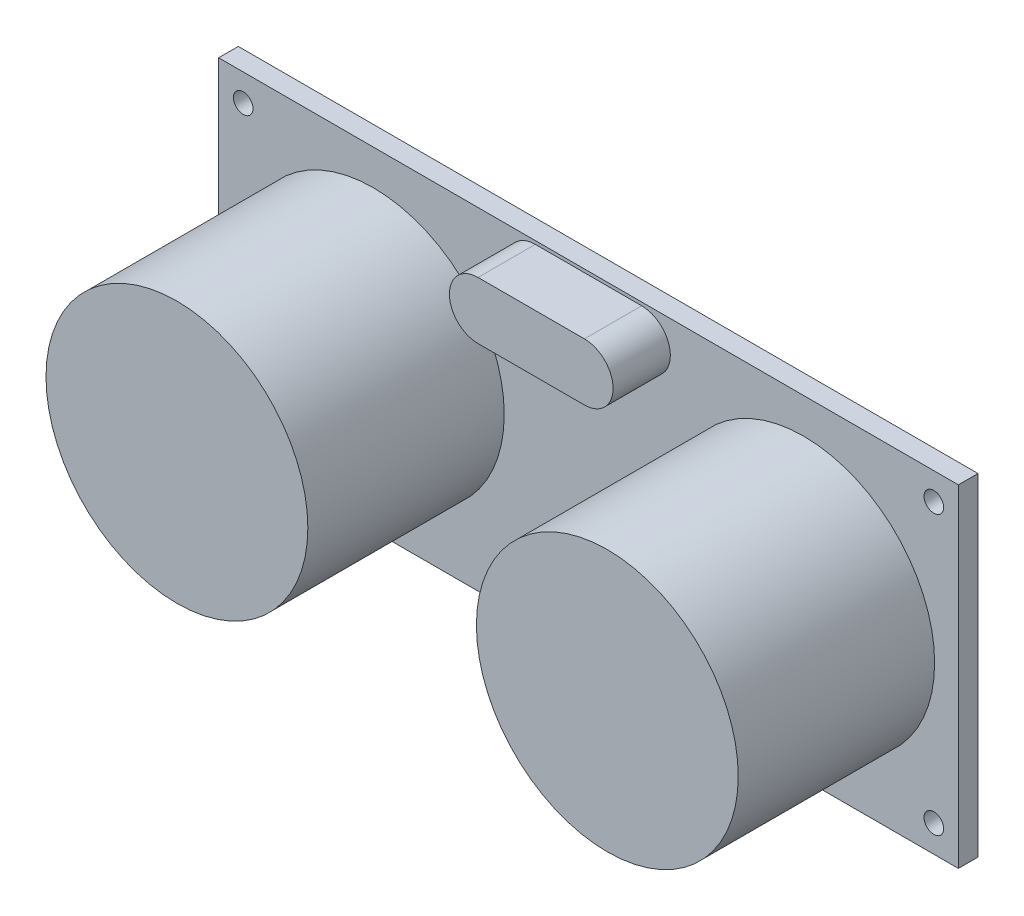
ISO-10303-21;
HEADER;
FILE_DESCRIPTION(('STEP AP214'),'2;1');
FILE_NAME('part.step','',(''),(''),'','','');
FILE_SCHEMA(('AUTOMOTIVE_DESIGN { 1 0 10303 214 1 1 1 1 }'));
ENDSEC;
DATA;
#1=APPLICATION_CONTEXT('core data for automotive mechanical design processes');
#2=APPLICATION_PROTOCOL_DEFINITION('international standard','automotive_design',2000,#1);
#3=PRODUCT_CONTEXT('',#1,'mechanical');
#4=PRODUCT('Part','Part','',(#3));
#5=PRODUCT_RELATED_PRODUCT_CATEGORY('part','',(#4));
#6=PRODUCT_DEFINITION_FORMATION('','',#4);
#7=PRODUCT_DEFINITION_CONTEXT('part definition',#1,'design');
#8=PRODUCT_DEFINITION('design','',#6,#7);
#9=PRODUCT_DEFINITION_SHAPE('','',#8);
#10=(LENGTH_UNIT() NAMED_UNIT(*) SI_UNIT(.MILLI.,.METRE.));
#11=(NAMED_UNIT(*) PLANE_ANGLE_UNIT() SI_UNIT($,.RADIAN.));
#12=(NAMED_UNIT(*) SI_UNIT($,.STERADIAN.) SOLID_ANGLE_UNIT());
#13=UNCERTAINTY_MEASURE_WITH_UNIT(LENGTH_MEASURE(1.E-05),#10,'distance_accuracy_value','');
#14=(GEOMETRIC_REPRESENTATION_CONTEXT(3) GLOBAL_UNCERTAINTY_ASSIGNED_CONTEXT((#13)) GLOBAL_UNIT_ASSIGNED_CONTEXT((#10,
#11,#12)) REPRESENTATION_CONTEXT('',''));
#15=CARTESIAN_POINT('',(0.,0.,0.));
#16=DIRECTION('',(0.,0.,1.));
#17=DIRECTION('',(1.,0.,0.));
#18=AXIS2_PLACEMENT_3D('',#15,#16,#17);
#19=CARTESIAN_POINT('',(0.,-15.9,-6.7));
#20=DIRECTION('',(0.,-1.,0.));
#21=DIRECTION('',(0.,0.,-1.));
#22=AXIS2_PLACEMENT_3D('',#19,#20,#21);
#23=PLANE('',#22);
#24=DIRECTION('',(0.,0.,1.));
#25=VECTOR('',#24,1.);
#26=CARTESIAN_POINT('',(5.,-15.9,-4.1));
#27=LINE('',#26,#25);
#28=CARTESIAN_POINT('',(5.,-15.9,-4.1));
#29=VERTEX_POINT('',#28);
#30=CARTESIAN_POINT('',(5.,-15.9,-1.7));
#31=VERTEX_POINT('',#30);
#32=EDGE_CURVE('P0_E142',#29,#31,#27,.T.);
#33=ORIENTED_EDGE('',*,*,#32,.T.);
#34=DIRECTION('',(-1.,0.,0.));
#35=VECTOR('',#34,1.);
#36=CARTESIAN_POINT('',(5.,-15.9,-1.7));
#37=LINE('',#36,#35);
#38=CARTESIAN_POINT('',(-5.,-15.9,-1.7));
#39=VERTEX_POINT('',#38);
#40=EDGE_CURVE('P0_E11',#31,#39,#37,.T.);
#41=ORIENTED_EDGE('',*,*,#40,.T.);
#42=DIRECTION('',(0.,0.,-1.));
#43=VECTOR('',#42,1.);
#44=CARTESIAN_POINT('',(-5.,-15.9,-1.7));
#45=LINE('',#44,#43);
#46=CARTESIAN_POINT('',(-5.,-15.9,-4.1));
#47=VERTEX_POINT('',#46);
#48=EDGE_CURVE('P0_E94',#39,#47,#45,.T.);
#49=ORIENTED_EDGE('',*,*,#48,.T.);
#50=DIRECTION('',(1.,0.,0.));
#51=VECTOR('',#50,1.);
#52=CARTESIAN_POINT('',(-5.,-15.9,-4.1));
#53=LINE('',#52,#51);
#54=EDGE_CURVE('P0_E126',#47,#29,#53,.T.);
#55=ORIENTED_EDGE('',*,*,#54,.T.);
#56=EDGE_LOOP('',(#33,#41,#49,#55));
#57=FACE_BOUND('',#56,.T.);
#58=ADVANCED_FACE('P0_F16',(#57),#23,.T.);
#59=CARTESIAN_POINT('',(0.,-13.025,-1.7));
#60=DIRECTION('',(0.,0.,1.));
#61=DIRECTION('',(1.,0.,0.));
#62=AXIS2_PLACEMENT_3D('',#59,#60,#61);
#63=PLANE('',#62);
#64=DIRECTION('',(-1.,0.,0.));
#65=VECTOR('',#64,1.);
#66=CARTESIAN_POINT('',(5.,-10.15,-1.7));
#67=LINE('',#66,#65);
#68=CARTESIAN_POINT('',(5.,-10.15,-1.7));
#69=VERTEX_POINT('',#68);
#70=CARTESIAN_POINT('',(-5.,-10.15,-1.7));
#71=VERTEX_POINT('',#70);
#72=EDGE_CURVE('P0_E92',#69,#71,#67,.T.);
#73=ORIENTED_EDGE('',*,*,#72,.T.);
#74=DIRECTION('',(0.,-1.,0.));
#75=VECTOR('',#74,1.);
#76=CARTESIAN_POINT('',(-5.,-10.15,-1.7));
#77=LINE('',#76,#75);
#78=EDGE_CURVE('P0_E24',#71,#39,#77,.T.);
#79=ORIENTED_EDGE('',*,*,#78,.T.);
#80=ORIENTED_EDGE('',*,*,#40,.F.);
#81=DIRECTION('',(0.,-1.,0.));
#82=VECTOR('',#81,1.);
#83=CARTESIAN_POINT('',(5.,-10.15,-1.7));
#84=LINE('',#83,#82);
#85=EDGE_CURVE('P0_E138',#69,#31,#84,.T.);
#86=ORIENTED_EDGE('',*,*,#85,.F.);
#87=EDGE_LOOP('',(#73,#79,#80,#86));
#88=FACE_BOUND('',#87,.T.);
#89=ADVANCED_FACE('P0_F152',(#88),#63,.T.);
#90=CARTESIAN_POINT('',(0.,-7.65,-2.05));
#91=DIRECTION('',(0.,1.,0.));
#92=DIRECTION('',(1.,0.,0.));
#93=AXIS2_PLACEMENT_3D('',#90,#91,#92);
#94=PLANE('',#93);
#95=DIRECTION('',(1.,0.,0.));
#96=VECTOR('',#95,1.);
#97=CARTESIAN_POINT('',(-5.,-7.65,0.));
#98=LINE('',#97,#96);
#99=CARTESIAN_POINT('',(-5.,-7.65,0.));
#100=VERTEX_POINT('',#99);
#101=CARTESIAN_POINT('',(5.,-7.65,0.));
#102=VERTEX_POINT('',#101);
#103=EDGE_CURVE('P0_E86',#100,#102,#98,.T.);
#104=ORIENTED_EDGE('',*,*,#103,.T.);
#105=DIRECTION('',(0.,0.,-1.));
#106=VECTOR('',#105,1.);
#107=CARTESIAN_POINT('',(5.,-7.65,0.));
#108=LINE('',#107,#106);
#109=CARTESIAN_POINT('',(5.,-7.65,-4.1));
#110=VERTEX_POINT('',#109);
#111=EDGE_CURVE('P0_E144',#102,#110,#108,.T.);
#112=ORIENTED_EDGE('',*,*,#111,.T.);
#113=DIRECTION('',(1.,0.,0.));
#114=VECTOR('',#113,1.);
#115=CARTESIAN_POINT('',(-5.,-7.65,-4.1));
#116=LINE('',#115,#114);
#117=CARTESIAN_POINT('',(-5.,-7.65,-4.1));
#118=VERTEX_POINT('',#117);
#119=EDGE_CURVE('P0_E89',#118,#110,#116,.T.);
#120=ORIENTED_EDGE('',*,*,#119,.F.);
#121=DIRECTION('',(0.,0.,-1.));
#122=VECTOR('',#121,1.);
#123=CARTESIAN_POINT('',(-5.,-7.65,0.));
#124=LINE('',#123,#122);
#125=EDGE_CURVE('P0_E82',#100,#118,#124,.T.);
#126=ORIENTED_EDGE('',*,*,#125,.F.);
#127=EDGE_LOOP('',(#104,#112,#120,#126));
#128=FACE_BOUND('',#127,.T.);
#129=ADVANCED_FACE('P0_F88',(#128),#94,.T.);
#130=CARTESIAN_POINT('',(-5.,-11.775,-2.05));
#131=DIRECTION('',(-1.,0.,0.));
#132=DIRECTION('',(0.,0.,1.));
#133=AXIS2_PLACEMENT_3D('',#130,#131,#132);
#134=PLANE('',#133);
#135=DIRECTION('',(0.,1.,0.));
#136=VECTOR('',#135,1.);
#137=CARTESIAN_POINT('',(-5.,-10.15,0.));
#138=LINE('',#137,#136);
#139=CARTESIAN_POINT('',(-5.,-10.15,0.));
#140=VERTEX_POINT('',#139);
#141=EDGE_CURVE('P0_E98',#140,#100,#138,.T.);
#142=ORIENTED_EDGE('',*,*,#141,.T.);
#143=ORIENTED_EDGE('',*,*,#125,.T.);
#144=DIRECTION('',(0.,1.,0.));
#145=VECTOR('',#144,1.);
#146=CARTESIAN_POINT('',(-5.,-15.9,-4.1));
#147=LINE('',#146,#145);
#148=EDGE_CURVE('P0_E131',#47,#118,#147,.T.);
#149=ORIENTED_EDGE('',*,*,#148,.F.);
#150=ORIENTED_EDGE('',*,*,#48,.F.);
#151=ORIENTED_EDGE('',*,*,#78,.F.);
#152=DIRECTION('',(0.,0.,-1.));
#153=VECTOR('',#152,1.);
#154=CARTESIAN_POINT('',(-5.,-10.15,0.));
#155=LINE('',#154,#153);
#156=EDGE_CURVE('P0_E101',#140,#71,#155,.T.);
#157=ORIENTED_EDGE('',*,*,#156,.F.);
#158=EDGE_LOOP('',(#142,#143,#149,#150,#151,#157));
#159=FACE_BOUND('',#158,.T.);
#160=ADVANCED_FACE('P0_F97',(#159),#134,.T.);
#161=CARTESIAN_POINT('',(0.,-10.15,-2.05));
#162=DIRECTION('',(0.,-1.,0.));
#163=DIRECTION('',(0.,0.,-1.));
#164=AXIS2_PLACEMENT_3D('',#161,#162,#163);
#165=PLANE('',#164);
#166=DIRECTION('',(-1.,0.,0.));
#167=VECTOR('',#166,1.);
#168=CARTESIAN_POINT('',(5.,-10.15,0.));
#169=LINE('',#168,#167);
#170=CARTESIAN_POINT('',(5.,-10.15,0.));
#171=VERTEX_POINT('',#170);
#172=EDGE_CURVE('P0_E106',#171,#140,#169,.T.);
#173=ORIENTED_EDGE('',*,*,#172,.T.);
#174=ORIENTED_EDGE('',*,*,#156,.T.);
#175=ORIENTED_EDGE('',*,*,#72,.F.);
#176=DIRECTION('',(0.,0.,-1.));
#177=VECTOR('',#176,1.);
#178=CARTESIAN_POINT('',(5.,-10.15,0.));
#179=LINE('',#178,#177);
#180=EDGE_CURVE('P0_E129',#171,#69,#179,.T.);
#181=ORIENTED_EDGE('',*,*,#180,.F.);
#182=EDGE_LOOP('',(#173,#174,#175,#181));
#183=FACE_BOUND('',#182,.T.);
#184=ADVANCED_FACE('P0_F162',(#183),#165,.T.);
#185=CARTESIAN_POINT('',(5.,-11.775,-2.05));
#186=DIRECTION('',(1.,0.,0.));
#187=DIRECTION('',(0.,1.,0.));
#188=AXIS2_PLACEMENT_3D('',#185,#186,#187);
#189=PLANE('',#188);
#190=DIRECTION('',(0.,-1.,0.));
#191=VECTOR('',#190,1.);
#192=CARTESIAN_POINT('',(5.,-7.65,0.));
#193=LINE('',#192,#191);
#194=EDGE_CURVE('P0_E112',#102,#171,#193,.T.);
#195=ORIENTED_EDGE('',*,*,#194,.T.);
#196=ORIENTED_EDGE('',*,*,#180,.T.);
#197=ORIENTED_EDGE('',*,*,#85,.T.);
#198=ORIENTED_EDGE('',*,*,#32,.F.);
#199=DIRECTION('',(0.,-1.,0.));
#200=VECTOR('',#199,1.);
#201=CARTESIAN_POINT('',(5.,-7.65,-4.1));
#202=LINE('',#201,#200);
#203=EDGE_CURVE('P0_E121',#110,#29,#202,.T.);
#204=ORIENTED_EDGE('',*,*,#203,.F.);
#205=ORIENTED_EDGE('',*,*,#111,.F.);
#206=EDGE_LOOP('',(#195,#196,#197,#198,#204,#205));
#207=FACE_BOUND('',#206,.T.);
#208=ADVANCED_FACE('P0_F161',(#207),#189,.T.);
#209=CARTESIAN_POINT('',(0.,-7.775,-4.1));
#210=DIRECTION('',(0.,0.,-1.));
#211=DIRECTION('',(0.,-1.,0.));
#212=AXIS2_PLACEMENT_3D('',#209,#210,#211);
#213=PLANE('',#212);
#214=ORIENTED_EDGE('',*,*,#203,.T.);
#215=ORIENTED_EDGE('',*,*,#54,.F.);
#216=ORIENTED_EDGE('',*,*,#148,.T.);
#217=ORIENTED_EDGE('',*,*,#119,.T.);
#218=EDGE_LOOP('',(#214,#215,#216,#217));
#219=FACE_BOUND('',#218,.T.);
#220=ADVANCED_FACE('P0_F157',(#219),#213,.T.);
#221=CARTESIAN_POINT('',(0.,-5.15,0.));
#222=DIRECTION('',(0.,0.,-1.));
#223=DIRECTION('',(0.,-1.,0.));
#224=AXIS2_PLACEMENT_3D('',#221,#222,#223);
#225=PLANE('',#224);
#226=ORIENTED_EDGE('',*,*,#103,.F.);
#227=ORIENTED_EDGE('',*,*,#141,.F.);
#228=ORIENTED_EDGE('',*,*,#172,.F.);
#229=ORIENTED_EDGE('',*,*,#194,.F.);
#230=EDGE_LOOP('',(#226,#227,#228,#229));
#231=FACE_BOUND('',#230,.T.);
#232=ADVANCED_FACE('P0_F108',(#231),#225,.F.);
#233=CLOSED_SHELL('',(#58,#89,#129,#160,#184,#208,#220,#232));
#234=MANIFOLD_SOLID_BREP('P0_B1',#233);
#235=CARTESIAN_POINT('',(0.,9.95,2.95));
#236=DIRECTION('',(0.,1.,0.));
#237=DIRECTION('',(1.,0.,0.));
#238=AXIS2_PLACEMENT_3D('',#235,#236,#237);
#239=PLANE('',#238);
#240=DIRECTION('',(-1.,0.,0.));
#241=VECTOR('',#240,1.);
#242=CARTESIAN_POINT('',(3.25,9.95,1.2));
#243=LINE('',#242,#241);
#244=CARTESIAN_POINT('',(3.25,9.95,1.2));
#245=VERTEX_POINT('',#244);
#246=CARTESIAN_POINT('',(-3.25,9.95,1.2));
#247=VERTEX_POINT('',#246);
#248=EDGE_CURVE('P1_E68',#245,#247,#243,.T.);
#249=ORIENTED_EDGE('',*,*,#248,.T.);
#250=DIRECTION('',(0.,0.,1.));
#251=VECTOR('',#250,1.);
#252=CARTESIAN_POINT('',(-3.25,9.95,1.2));
#253=LINE('',#252,#251);
#254=CARTESIAN_POINT('',(-3.25,9.95,4.7));
#255=VERTEX_POINT('',#254);
#256=EDGE_CURVE('P1_E64',#247,#255,#253,.T.);
#257=ORIENTED_EDGE('',*,*,#256,.T.);
#258=DIRECTION('',(-1.,0.,0.));
#259=VECTOR('',#258,1.);
#260=CARTESIAN_POINT('',(3.25,9.95,4.7));
#261=LINE('',#260,#259);
#262=CARTESIAN_POINT('',(3.25,9.95,4.7));
#263=VERTEX_POINT('',#262);
#264=EDGE_CURVE('P1_E65',#263,#255,#261,.T.);
#265=ORIENTED_EDGE('',*,*,#264,.F.);
#266=DIRECTION('',(0.,0.,1.));
#267=VECTOR('',#266,1.);
#268=CARTESIAN_POINT('',(3.25,9.95,1.2));
#269=LINE('',#268,#267);
#270=EDGE_CURVE('P1_E11',#245,#263,#269,.T.);
#271=ORIENTED_EDGE('',*,*,#270,.F.);
#272=EDGE_LOOP('',(#249,#257,#265,#271));
#273=FACE_BOUND('',#272,.T.);
#274=ADVANCED_FACE('P1_F16',(#273),#239,.T.);
#275=CARTESIAN_POINT('',(3.25,8.2,1.2));
#276=DIRECTION('',(0.,0.,1.));
#277=DIRECTION('',(0.,-1.,0.));
#278=AXIS2_PLACEMENT_3D('',#275,#276,#277);
#279=CYLINDRICAL_SURFACE('',#278,1.75);
#280=CARTESIAN_POINT('',(3.25,8.2,1.2));
#281=DIRECTION('',(0.,0.,1.));
#282=DIRECTION('',(0.,-1.,0.));
#283=AXIS2_PLACEMENT_3D('',#280,#281,#282);
#284=CIRCLE('',#283,1.75);
#285=CARTESIAN_POINT('',(3.25,6.45,1.2));
#286=VERTEX_POINT('',#285);
#287=EDGE_CURVE('P1_E114',#286,#245,#284,.T.);
#288=ORIENTED_EDGE('',*,*,#287,.T.);
#289=ORIENTED_EDGE('',*,*,#270,.T.);
#290=CARTESIAN_POINT('',(3.25,8.2,4.7));
#291=DIRECTION('',(0.,0.,1.));
#292=DIRECTION('',(0.,-1.,0.));
#293=AXIS2_PLACEMENT_3D('',#290,#291,#292);
#294=CIRCLE('',#293,1.75);
#295=CARTESIAN_POINT('',(3.25,6.45,4.7));
#296=VERTEX_POINT('',#295);
#297=EDGE_CURVE('P1_E81',#296,#263,#294,.T.);
#298=ORIENTED_EDGE('',*,*,#297,.F.);
#299=DIRECTION('',(0.,0.,1.));
#300=VECTOR('',#299,1.);
#301=CARTESIAN_POINT('',(3.25,6.45,1.2));
#302=LINE('',#301,#300);
#303=EDGE_CURVE('P1_E25',#286,#296,#302,.T.);
#304=ORIENTED_EDGE('',*,*,#303,.F.);
#305=EDGE_LOOP('',(#288,#289,#298,#304));
#306=FACE_BOUND('',#305,.T.);
#307=ADVANCED_FACE('P1_F110',(#306),#279,.T.);
#308=CARTESIAN_POINT('',(0.,6.45,2.95));
#309=DIRECTION('',(0.,-1.,0.));
#310=DIRECTION('',(0.,0.,-1.));
#311=AXIS2_PLACEMENT_3D('',#308,#309,#310);
#312=PLANE('',#311);
#313=DIRECTION('',(1.,0.,0.));
#314=VECTOR('',#313,1.);
#315=CARTESIAN_POINT('',(-3.25,6.45,1.2));
#316=LINE('',#315,#314);
#317=CARTESIAN_POINT('',(-3.25,6.45,1.2));
#318=VERTEX_POINT('',#317);
#319=EDGE_CURVE('P1_E92',#318,#286,#316,.T.);
#320=ORIENTED_EDGE('',*,*,#319,.T.);
#321=ORIENTED_EDGE('',*,*,#303,.T.);
#322=DIRECTION('',(1.,0.,0.));
#323=VECTOR('',#322,1.);
#324=CARTESIAN_POINT('',(-3.25,6.45,4.7));
#325=LINE('',#324,#323);
#326=CARTESIAN_POINT('',(-3.25,6.45,4.7));
#327=VERTEX_POINT('',#326);
#328=EDGE_CURVE('P1_E87',#327,#296,#325,.T.);
#329=ORIENTED_EDGE('',*,*,#328,.F.);
#330=DIRECTION('',(0.,0.,1.));
#331=VECTOR('',#330,1.);
#332=CARTESIAN_POINT('',(-3.25,6.45,1.2));
#333=LINE('',#332,#331);
#334=EDGE_CURVE('P1_E72',#318,#327,#333,.T.);
#335=ORIENTED_EDGE('',*,*,#334,.F.);
#336=EDGE_LOOP('',(#320,#321,#329,#335));
#337=FACE_BOUND('',#336,.T.);
#338=ADVANCED_FACE('P1_F102',(#337),#312,.T.);
#339=CARTESIAN_POINT('',(-3.25,8.2,1.2));
#340=DIRECTION('',(0.,0.,1.));
#341=DIRECTION('',(0.,1.,0.));
#342=AXIS2_PLACEMENT_3D('',#339,#340,#341);
#343=CYLINDRICAL_SURFACE('',#342,1.75);
#344=CARTESIAN_POINT('',(-3.25,8.2,1.2));
#345=DIRECTION('',(0.,0.,1.));
#346=DIRECTION('',(0.,1.,0.));
#347=AXIS2_PLACEMENT_3D('',#344,#345,#346);
#348=CIRCLE('',#347,1.75);
#349=EDGE_CURVE('P1_E86',#247,#318,#348,.T.);
#350=ORIENTED_EDGE('',*,*,#349,.T.);
#351=ORIENTED_EDGE('',*,*,#334,.T.);
#352=CARTESIAN_POINT('',(-3.25,8.2,4.7));
#353=DIRECTION('',(0.,0.,1.));
#354=DIRECTION('',(0.,1.,0.));
#355=AXIS2_PLACEMENT_3D('',#352,#353,#354);
#356=CIRCLE('',#355,1.75);
#357=EDGE_CURVE('P1_E79',#255,#327,#356,.T.);
#358=ORIENTED_EDGE('',*,*,#357,.F.);
#359=ORIENTED_EDGE('',*,*,#256,.F.);
#360=EDGE_LOOP('',(#350,#351,#358,#359));
#361=FACE_BOUND('',#360,.T.);
#362=ADVANCED_FACE('P1_F82',(#361),#343,.T.);
#363=CARTESIAN_POINT('',(0.,11.45,4.7));
#364=DIRECTION('',(0.,0.,1.));
#365=DIRECTION('',(1.,0.,0.));
#366=AXIS2_PLACEMENT_3D('',#363,#364,#365);
#367=PLANE('',#366);
#368=ORIENTED_EDGE('',*,*,#357,.T.);
#369=ORIENTED_EDGE('',*,*,#328,.T.);
#370=ORIENTED_EDGE('',*,*,#297,.T.);
#371=ORIENTED_EDGE('',*,*,#264,.T.);
#372=EDGE_LOOP('',(#368,#369,#370,#371));
#373=FACE_BOUND('',#372,.T.);
#374=ADVANCED_FACE('P1_F77',(#373),#367,.T.);
#375=CARTESIAN_POINT('',(0.,11.45,1.2));
#376=DIRECTION('',(0.,0.,1.));
#377=DIRECTION('',(1.,0.,0.));
#378=AXIS2_PLACEMENT_3D('',#375,#376,#377);
#379=PLANE('',#378);
#380=ORIENTED_EDGE('',*,*,#248,.F.);
#381=ORIENTED_EDGE('',*,*,#287,.F.);
#382=ORIENTED_EDGE('',*,*,#319,.F.);
#383=ORIENTED_EDGE('',*,*,#349,.F.);
#384=EDGE_LOOP('',(#380,#381,#382,#383));
#385=FACE_BOUND('',#384,.T.);
#386=ADVANCED_FACE('P1_F122',(#385),#379,.F.);
#387=CLOSED_SHELL('',(#274,#307,#338,#362,#374,#386));
#388=MANIFOLD_SOLID_BREP('P1_B1',#387);
#389=CARTESIAN_POINT('',(13.15,0.,1.2));
#390=DIRECTION('',(0.,0.,1.));
#391=DIRECTION('',(1.,0.,0.));
#392=AXIS2_PLACEMENT_3D('',#389,#390,#391);
#393=CYLINDRICAL_SURFACE('',#392,8.);
#394=CARTESIAN_POINT('',(13.15,0.,1.2));
#395=DIRECTION('',(0.,0.,1.));
#396=DIRECTION('',(1.,0.,0.));
#397=AXIS2_PLACEMENT_3D('',#394,#395,#396);
#398=CIRCLE('',#397,8.);
#399=CARTESIAN_POINT('',(21.15,0.,1.2));
#400=VERTEX_POINT('',#399);
#401=EDGE_CURVE('P2_E39',#400,#400,#398,.T.);
#402=ORIENTED_EDGE('',*,*,#401,.T.);
#403=DIRECTION('',(0.,0.,1.));
#404=VECTOR('',#403,1.);
#405=CARTESIAN_POINT('',(21.15,0.,1.2));
#406=LINE('',#405,#404);
#407=CARTESIAN_POINT('',(21.15,0.,13.2));
#408=VERTEX_POINT('',#407);
#409=EDGE_CURVE('P2_E11',#400,#408,#406,.T.);
#410=ORIENTED_EDGE('',*,*,#409,.T.);
#411=CARTESIAN_POINT('',(13.15,0.,13.2));
#412=DIRECTION('',(0.,0.,1.));
#413=DIRECTION('',(1.,0.,0.));
#414=AXIS2_PLACEMENT_3D('',#411,#412,#413);
#415=CIRCLE('',#414,8.);
#416=EDGE_CURVE('P2_E24',#408,#408,#415,.T.);
#417=ORIENTED_EDGE('',*,*,#416,.F.);
#418=ORIENTED_EDGE('',*,*,#409,.F.);
#419=EDGE_LOOP('',(#402,#410,#417,#418));
#420=FACE_BOUND('',#419,.T.);
#421=ADVANCED_FACE('P2_F16',(#420),#393,.T.);
#422=CARTESIAN_POINT('',(11.006406460551,0.,13.2));
#423=DIRECTION('',(0.,0.,1.));
#424=DIRECTION('',(1.,0.,0.));
#425=AXIS2_PLACEMENT_3D('',#422,#423,#424);
#426=PLANE('',#425);
#427=ORIENTED_EDGE('',*,*,#416,.T.);
#428=EDGE_LOOP('',(#427));
#429=FACE_BOUND('',#428,.T.);
#430=ADVANCED_FACE('P2_F49',(#429),#426,.T.);
#431=CARTESIAN_POINT('',(11.006406460551,0.,1.2));
#432=DIRECTION('',(0.,0.,1.));
#433=DIRECTION('',(1.,0.,0.));
#434=AXIS2_PLACEMENT_3D('',#431,#432,#433);
#435=PLANE('',#434);
#436=ORIENTED_EDGE('',*,*,#401,.F.);
#437=EDGE_LOOP('',(#436));
#438=FACE_BOUND('',#437,.T.);
#439=ADVANCED_FACE('P2_F57',(#438),#435,.F.);
#440=CLOSED_SHELL('',(#421,#430,#439));
#441=MANIFOLD_SOLID_BREP('P2_B1',#440);
#442=CARTESIAN_POINT('',(-13.15,0.,1.2));
#443=DIRECTION('',(0.,0.,1.));
#444=DIRECTION('',(1.,0.,0.));
#445=AXIS2_PLACEMENT_3D('',#442,#443,#444);
#446=CYLINDRICAL_SURFACE('',#445,8.);
#447=CARTESIAN_POINT('',(-13.15,0.,1.2));
#448=DIRECTION('',(0.,0.,1.));
#449=DIRECTION('',(1.,0.,0.));
#450=AXIS2_PLACEMENT_3D('',#447,#448,#449);
#451=CIRCLE('',#450,8.);
#452=CARTESIAN_POINT('',(-5.15,0.,1.2));
#453=VERTEX_POINT('',#452);
#454=EDGE_CURVE('P3_E37',#453,#453,#451,.T.);
#455=ORIENTED_EDGE('',*,*,#454,.T.);
#456=DIRECTION('',(0.,0.,1.));
#457=VECTOR('',#456,1.);
#458=CARTESIAN_POINT('',(-5.15,0.,1.2));
#459=LINE('',#458,#457);
#460=CARTESIAN_POINT('',(-5.15,0.,13.2));
#461=VERTEX_POINT('',#460);
#462=EDGE_CURVE('P3_E11',#453,#461,#459,.T.);
#463=ORIENTED_EDGE('',*,*,#462,.T.);
#464=CARTESIAN_POINT('',(-13.15,0.,13.2));
#465=DIRECTION('',(0.,0.,1.));
#466=DIRECTION('',(1.,0.,0.));
#467=AXIS2_PLACEMENT_3D('',#464,#465,#466);
#468=CIRCLE('',#467,8.);
#469=EDGE_CURVE('P3_E25',#461,#461,#468,.T.);
#470=ORIENTED_EDGE('',*,*,#469,.F.);
#471=ORIENTED_EDGE('',*,*,#462,.F.);
#472=EDGE_LOOP('',(#455,#463,#470,#471));
#473=FACE_BOUND('',#472,.T.);
#474=ADVANCED_FACE('P3_F16',(#473),#446,.T.);
#475=CARTESIAN_POINT('',(-15.293593539449,0.,13.2));
#476=DIRECTION('',(0.,0.,1.));
#477=DIRECTION('',(1.,0.,0.));
#478=AXIS2_PLACEMENT_3D('',#475,#476,#477);
#479=PLANE('',#478);
#480=ORIENTED_EDGE('',*,*,#469,.T.);
#481=EDGE_LOOP('',(#480));
#482=FACE_BOUND('',#481,.T.);
#483=ADVANCED_FACE('P3_F18',(#482),#479,.T.);
#484=CARTESIAN_POINT('',(-15.293593539449,0.,1.2));
#485=DIRECTION('',(0.,0.,1.));
#486=DIRECTION('',(1.,0.,0.));
#487=AXIS2_PLACEMENT_3D('',#484,#485,#486);
#488=PLANE('',#487);
#489=ORIENTED_EDGE('',*,*,#454,.F.);
#490=EDGE_LOOP('',(#489));
#491=FACE_BOUND('',#490,.T.);
#492=ADVANCED_FACE('P3_F51',(#491),#488,.F.);
#493=CLOSED_SHELL('',(#474,#483,#492));
#494=MANIFOLD_SOLID_BREP('P3_B1',#493);
#495=CARTESIAN_POINT('',(-21.1,-8.5,1.2));
#496=DIRECTION('',(0.,0.,-1.));
#497=DIRECTION('',(1.,0.,0.));
#498=AXIS2_PLACEMENT_3D('',#495,#496,#497);
#499=CYLINDRICAL_SURFACE('',#498,0.6);
#500=CARTESIAN_POINT('',(-21.1,-8.5,1.2));
#501=DIRECTION('',(0.,0.,1.));
#502=DIRECTION('',(1.,0.,0.));
#503=AXIS2_PLACEMENT_3D('',#500,#501,#502);
#504=CIRCLE('',#503,0.6);
#505=CARTESIAN_POINT('',(-20.5,-8.5,1.2));
#506=VERTEX_POINT('',#505);
#507=EDGE_CURVE('P4_E118',#506,#506,#504,.T.);
#508=ORIENTED_EDGE('',*,*,#507,.T.);
#509=DIRECTION('',(0.,0.,-1.));
#510=VECTOR('',#509,1.);
#511=CARTESIAN_POINT('',(-20.5,-8.5,1.2));
#512=LINE('',#511,#510);
#513=CARTESIAN_POINT('',(-20.5,-8.5,0.));
#514=VERTEX_POINT('',#513);
#515=EDGE_CURVE('P4_E10',#506,#514,#512,.T.);
#516=ORIENTED_EDGE('',*,*,#515,.T.);
#517=CARTESIAN_POINT('',(-21.1,-8.5,0.));
#518=DIRECTION('',(0.,0.,1.));
#519=DIRECTION('',(1.,0.,0.));
#520=AXIS2_PLACEMENT_3D('',#517,#518,#519);
#521=CIRCLE('',#520,0.6);
#522=EDGE_CURVE('P4_E105',#514,#514,#521,.T.);
#523=ORIENTED_EDGE('',*,*,#522,.F.);
#524=ORIENTED_EDGE('',*,*,#515,.F.);
#525=EDGE_LOOP('',(#508,#516,#523,#524));
#526=FACE_BOUND('',#525,.T.);
#527=ADVANCED_FACE('P4_F15',(#526),#499,.F.);
#528=CARTESIAN_POINT('',(-21.1,8.5,1.2));
#529=DIRECTION('',(0.,0.,-1.));
#530=DIRECTION('',(1.,0.,0.));
#531=AXIS2_PLACEMENT_3D('',#528,#529,#530);
#532=CYLINDRICAL_SURFACE('',#531,0.6);
#533=CARTESIAN_POINT('',(-21.1,8.5,1.2));
#534=DIRECTION('',(0.,0.,1.));
#535=DIRECTION('',(1.,0.,0.));
#536=AXIS2_PLACEMENT_3D('',#533,#534,#535);
#537=CIRCLE('',#536,0.6);
#538=CARTESIAN_POINT('',(-20.5,8.5,1.2));
#539=VERTEX_POINT('',#538);
#540=EDGE_CURVE('P4_E113',#539,#539,#537,.T.);
#541=ORIENTED_EDGE('',*,*,#540,.T.);
#542=DIRECTION('',(0.,0.,-1.));
#543=VECTOR('',#542,1.);
#544=CARTESIAN_POINT('',(-20.5,8.5,1.2));
#545=LINE('',#544,#543);
#546=CARTESIAN_POINT('',(-20.5,8.5,0.));
#547=VERTEX_POINT('',#546);
#548=EDGE_CURVE('P4_E24',#539,#547,#545,.T.);
#549=ORIENTED_EDGE('',*,*,#548,.T.);
#550=CARTESIAN_POINT('',(-21.1,8.5,0.));
#551=DIRECTION('',(0.,0.,1.));
#552=DIRECTION('',(1.,0.,0.));
#553=AXIS2_PLACEMENT_3D('',#550,#551,#552);
#554=CIRCLE('',#553,0.6);
#555=EDGE_CURVE('P4_E92',#547,#547,#554,.T.);
#556=ORIENTED_EDGE('',*,*,#555,.F.);
#557=ORIENTED_EDGE('',*,*,#548,.F.);
#558=EDGE_LOOP('',(#541,#549,#556,#557));
#559=FACE_BOUND('',#558,.T.);
#560=ADVANCED_FACE('P4_F126',(#559),#532,.F.);
#561=CARTESIAN_POINT('',(21.1,8.5,1.2));
#562=DIRECTION('',(0.,0.,-1.));
#563=DIRECTION('',(1.,0.,0.));
#564=AXIS2_PLACEMENT_3D('',#561,#562,#563);
#565=CYLINDRICAL_SURFACE('',#564,0.6);
#566=CARTESIAN_POINT('',(21.1,8.5,1.2));
#567=DIRECTION('',(0.,0.,1.));
#568=DIRECTION('',(1.,0.,0.));
#569=AXIS2_PLACEMENT_3D('',#566,#567,#568);
#570=CIRCLE('',#569,0.6);
#571=CARTESIAN_POINT('',(21.7,8.5,1.2));
#572=VERTEX_POINT('',#571);
#573=EDGE_CURVE('P4_E86',#572,#572,#570,.T.);
#574=ORIENTED_EDGE('',*,*,#573,.T.);
#575=DIRECTION('',(0.,0.,-1.));
#576=VECTOR('',#575,1.);
#577=CARTESIAN_POINT('',(21.7,8.5,1.2));
#578=LINE('',#577,#576);
#579=CARTESIAN_POINT('',(21.7,8.5,0.));
#580=VERTEX_POINT('',#579);
#581=EDGE_CURVE('P4_E50',#572,#580,#578,.T.);
#582=ORIENTED_EDGE('',*,*,#581,.T.);
#583=CARTESIAN_POINT('',(21.1,8.5,0.));
#584=DIRECTION('',(0.,0.,1.));
#585=DIRECTION('',(1.,0.,0.));
#586=AXIS2_PLACEMENT_3D('',#583,#584,#585);
#587=CIRCLE('',#586,0.6);
#588=EDGE_CURVE('P4_E88',#580,#580,#587,.T.);
#589=ORIENTED_EDGE('',*,*,#588,.F.);
#590=ORIENTED_EDGE('',*,*,#581,.F.);
#591=EDGE_LOOP('',(#574,#582,#589,#590));
#592=FACE_BOUND('',#591,.T.);
#593=ADVANCED_FACE('P4_F84',(#592),#565,.F.);
#594=CARTESIAN_POINT('',(21.1,-8.5,1.2));
#595=DIRECTION('',(0.,0.,-1.));
#596=DIRECTION('',(1.,0.,0.));
#597=AXIS2_PLACEMENT_3D('',#594,#595,#596);
#598=CYLINDRICAL_SURFACE('',#597,0.6);
#599=CARTESIAN_POINT('',(21.1,-8.5,1.2));
#600=DIRECTION('',(0.,0.,1.));
#601=DIRECTION('',(1.,0.,0.));
#602=AXIS2_PLACEMENT_3D('',#599,#600,#601);
#603=CIRCLE('',#602,0.6);
#604=CARTESIAN_POINT('',(21.7,-8.5,1.2));
#605=VERTEX_POINT('',#604);
#606=EDGE_CURVE('P4_E109',#605,#605,#603,.T.);
#607=ORIENTED_EDGE('',*,*,#606,.T.);
#608=DIRECTION('',(0.,0.,-1.));
#609=VECTOR('',#608,1.);
#610=CARTESIAN_POINT('',(21.7,-8.5,1.2));
#611=LINE('',#610,#609);
#612=CARTESIAN_POINT('',(21.7,-8.5,0.));
#613=VERTEX_POINT('',#612);
#614=EDGE_CURVE('P4_E57',#605,#613,#611,.T.);
#615=ORIENTED_EDGE('',*,*,#614,.T.);
#616=CARTESIAN_POINT('',(21.1,-8.5,0.));
#617=DIRECTION('',(0.,0.,1.));
#618=DIRECTION('',(1.,0.,0.));
#619=AXIS2_PLACEMENT_3D('',#616,#617,#618);
#620=CIRCLE('',#619,0.6);
#621=EDGE_CURVE('P4_E96',#613,#613,#620,.T.);
#622=ORIENTED_EDGE('',*,*,#621,.F.);
#623=ORIENTED_EDGE('',*,*,#614,.F.);
#624=EDGE_LOOP('',(#607,#615,#622,#623));
#625=FACE_BOUND('',#624,.T.);
#626=ADVANCED_FACE('P4_F141',(#625),#598,.F.);
#627=CARTESIAN_POINT('',(0.,12.45,1.2));
#628=DIRECTION('',(0.,0.,1.));
#629=DIRECTION('',(1.,0.,0.));
#630=AXIS2_PLACEMENT_3D('',#627,#628,#629);
#631=PLANE('',#630);
#632=ORIENTED_EDGE('',*,*,#507,.F.);
#633=EDGE_LOOP('',(#632));
#634=FACE_BOUND('',#633,.T.);
#635=ORIENTED_EDGE('',*,*,#540,.F.);
#636=EDGE_LOOP('',(#635));
#637=FACE_BOUND('',#636,.T.);
#638=ORIENTED_EDGE('',*,*,#573,.F.);
#639=EDGE_LOOP('',(#638));
#640=FACE_BOUND('',#639,.T.);
#641=ORIENTED_EDGE('',*,*,#606,.F.);
#642=EDGE_LOOP('',(#641));
#643=FACE_BOUND('',#642,.T.);
#644=DIRECTION('',(1.,0.,0.));
#645=VECTOR('',#644,1.);
#646=CARTESIAN_POINT('',(-22.6,-10.15,1.2));
#647=LINE('',#646,#645);
#648=CARTESIAN_POINT('',(-22.6,-10.15,1.2));
#649=VERTEX_POINT('',#648);
#650=CARTESIAN_POINT('',(22.6,-10.15,1.2));
#651=VERTEX_POINT('',#650);
#652=EDGE_CURVE('P4_E165',#649,#651,#647,.T.);
#653=ORIENTED_EDGE('',*,*,#652,.T.);
#654=DIRECTION('',(0.,1.,0.));
#655=VECTOR('',#654,1.);
#656=CARTESIAN_POINT('',(22.6,-10.15,1.2));
#657=LINE('',#656,#655);
#658=CARTESIAN_POINT('',(22.6,10.15,1.2));
#659=VERTEX_POINT('',#658);
#660=EDGE_CURVE('P4_E167',#651,#659,#657,.T.);
#661=ORIENTED_EDGE('',*,*,#660,.T.);
#662=DIRECTION('',(-1.,0.,0.));
#663=VECTOR('',#662,1.);
#664=CARTESIAN_POINT('',(22.6,10.15,1.2));
#665=LINE('',#664,#663);
#666=CARTESIAN_POINT('',(-22.6,10.15,1.2));
#667=VERTEX_POINT('',#666);
#668=EDGE_CURVE('P4_E204',#659,#667,#665,.T.);
#669=ORIENTED_EDGE('',*,*,#668,.T.);
#670=DIRECTION('',(0.,-1.,0.));
#671=VECTOR('',#670,1.);
#672=CARTESIAN_POINT('',(-22.6,10.15,1.2));
#673=LINE('',#672,#671);
#674=EDGE_CURVE('P4_E106',#667,#649,#673,.T.);
#675=ORIENTED_EDGE('',*,*,#674,.T.);
#676=EDGE_LOOP('',(#653,#661,#669,#675));
#677=FACE_BOUND('',#676,.T.);
#678=ADVANCED_FACE('P4_F135',(#634,#637,#640,#643,#677),#631,.T.);
#679=CARTESIAN_POINT('',(0.,12.45,0.));
#680=DIRECTION('',(0.,0.,1.));
#681=DIRECTION('',(1.,0.,0.));
#682=AXIS2_PLACEMENT_3D('',#679,#680,#681);
#683=PLANE('',#682);
#684=ORIENTED_EDGE('',*,*,#522,.T.);
#685=EDGE_LOOP('',(#684));
#686=FACE_BOUND('',#685,.T.);
#687=ORIENTED_EDGE('',*,*,#555,.T.);
#688=EDGE_LOOP('',(#687));
#689=FACE_BOUND('',#688,.T.);
#690=ORIENTED_EDGE('',*,*,#588,.T.);
#691=EDGE_LOOP('',(#690));
#692=FACE_BOUND('',#691,.T.);
#693=ORIENTED_EDGE('',*,*,#621,.T.);
#694=EDGE_LOOP('',(#693));
#695=FACE_BOUND('',#694,.T.);
#696=DIRECTION('',(0.,-1.,0.));
#697=VECTOR('',#696,1.);
#698=CARTESIAN_POINT('',(-22.6,10.15,0.));
#699=LINE('',#698,#697);
#700=CARTESIAN_POINT('',(-22.6,10.15,0.));
#701=VERTEX_POINT('',#700);
#702=CARTESIAN_POINT('',(-22.6,-10.15,0.));
#703=VERTEX_POINT('',#702);
#704=EDGE_CURVE('P4_E213',#701,#703,#699,.T.);
#705=ORIENTED_EDGE('',*,*,#704,.F.);
#706=DIRECTION('',(-1.,0.,0.));
#707=VECTOR('',#706,1.);
#708=CARTESIAN_POINT('',(22.6,10.15,0.));
#709=LINE('',#708,#707);
#710=CARTESIAN_POINT('',(22.6,10.15,0.));
#711=VERTEX_POINT('',#710);
#712=EDGE_CURVE('P4_E202',#711,#701,#709,.T.);
#713=ORIENTED_EDGE('',*,*,#712,.F.);
#714=DIRECTION('',(0.,1.,0.));
#715=VECTOR('',#714,1.);
#716=CARTESIAN_POINT('',(22.6,-10.15,0.));
#717=LINE('',#716,#715);
#718=CARTESIAN_POINT('',(22.6,-10.15,0.));
#719=VERTEX_POINT('',#718);
#720=EDGE_CURVE('P4_E192',#719,#711,#717,.T.);
#721=ORIENTED_EDGE('',*,*,#720,.F.);
#722=DIRECTION('',(1.,0.,0.));
#723=VECTOR('',#722,1.);
#724=CARTESIAN_POINT('',(-22.6,-10.15,0.));
#725=LINE('',#724,#723);
#726=EDGE_CURVE('P4_E183',#703,#719,#725,.T.);
#727=ORIENTED_EDGE('',*,*,#726,.F.);
#728=EDGE_LOOP('',(#705,#713,#721,#727));
#729=FACE_BOUND('',#728,.T.);
#730=ADVANCED_FACE('P4_F95',(#686,#689,#692,#695,#729),#683,.F.);
#731=CARTESIAN_POINT('',(-22.6,0.,0.6));
#732=DIRECTION('',(-1.,0.,0.));
#733=DIRECTION('',(0.,0.,1.));
#734=AXIS2_PLACEMENT_3D('',#731,#732,#733);
#735=PLANE('',#734);
#736=ORIENTED_EDGE('',*,*,#704,.T.);
#737=DIRECTION('',(0.,0.,1.));
#738=VECTOR('',#737,1.);
#739=CARTESIAN_POINT('',(-22.6,-10.15,0.));
#740=LINE('',#739,#738);
#741=EDGE_CURVE('P4_E177',#703,#649,#740,.T.);
#742=ORIENTED_EDGE('',*,*,#741,.T.);
#743=ORIENTED_EDGE('',*,*,#674,.F.);
#744=DIRECTION('',(0.,0.,1.));
#745=VECTOR('',#744,1.);
#746=CARTESIAN_POINT('',(-22.6,10.15,0.));
#747=LINE('',#746,#745);
#748=EDGE_CURVE('P4_E199',#701,#667,#747,.T.);
#749=ORIENTED_EDGE('',*,*,#748,.F.);
#750=EDGE_LOOP('',(#736,#742,#743,#749));
#751=FACE_BOUND('',#750,.T.);
#752=ADVANCED_FACE('P4_F131',(#751),#735,.T.);
#753=CARTESIAN_POINT('',(0.,10.15,0.6));
#754=DIRECTION('',(0.,1.,0.));
#755=DIRECTION('',(1.,0.,0.));
#756=AXIS2_PLACEMENT_3D('',#753,#754,#755);
#757=PLANE('',#756);
#758=ORIENTED_EDGE('',*,*,#712,.T.);
#759=ORIENTED_EDGE('',*,*,#748,.T.);
#760=ORIENTED_EDGE('',*,*,#668,.F.);
#761=DIRECTION('',(0.,0.,1.));
#762=VECTOR('',#761,1.);
#763=CARTESIAN_POINT('',(22.6,10.15,0.));
#764=LINE('',#763,#762);
#765=EDGE_CURVE('P4_E197',#711,#659,#764,.T.);
#766=ORIENTED_EDGE('',*,*,#765,.F.);
#767=EDGE_LOOP('',(#758,#759,#760,#766));
#768=FACE_BOUND('',#767,.T.);
#769=ADVANCED_FACE('P4_F139',(#768),#757,.T.);
#770=CARTESIAN_POINT('',(22.6,0.,0.6));
#771=DIRECTION('',(1.,0.,0.));
#772=DIRECTION('',(0.,1.,0.));
#773=AXIS2_PLACEMENT_3D('',#770,#771,#772);
#774=PLANE('',#773);
#775=ORIENTED_EDGE('',*,*,#720,.T.);
#776=ORIENTED_EDGE('',*,*,#765,.T.);
#777=ORIENTED_EDGE('',*,*,#660,.F.);
#778=DIRECTION('',(0.,0.,1.));
#779=VECTOR('',#778,1.);
#780=CARTESIAN_POINT('',(22.6,-10.15,0.));
#781=LINE('',#780,#779);
#782=EDGE_CURVE('P4_E180',#719,#651,#781,.T.);
#783=ORIENTED_EDGE('',*,*,#782,.F.);
#784=EDGE_LOOP('',(#775,#776,#777,#783));
#785=FACE_BOUND('',#784,.T.);
#786=ADVANCED_FACE('P4_F241',(#785),#774,.T.);
#787=CARTESIAN_POINT('',(0.,-10.15,0.6));
#788=DIRECTION('',(0.,-1.,0.));
#789=DIRECTION('',(0.,0.,-1.));
#790=AXIS2_PLACEMENT_3D('',#787,#788,#789);
#791=PLANE('',#790);
#792=ORIENTED_EDGE('',*,*,#726,.T.);
#793=ORIENTED_EDGE('',*,*,#782,.T.);
#794=ORIENTED_EDGE('',*,*,#652,.F.);
#795=ORIENTED_EDGE('',*,*,#741,.F.);
#796=EDGE_LOOP('',(#792,#793,#794,#795));
#797=FACE_BOUND('',#796,.T.);
#798=ADVANCED_FACE('P4_F185',(#797),#791,.T.);
#799=CLOSED_SHELL('',(#527,#560,#593,#626,#678,#730,#752,#769,#786,#798));
#800=MANIFOLD_SOLID_BREP('P4_B1',#799);
#801=ADVANCED_BREP_SHAPE_REPRESENTATION('',(#18,#234,#388,#441,#494,#800),#14);
#802=SHAPE_DEFINITION_REPRESENTATION(#9,#801);
ENDSEC;
END-ISO-10303-21;
